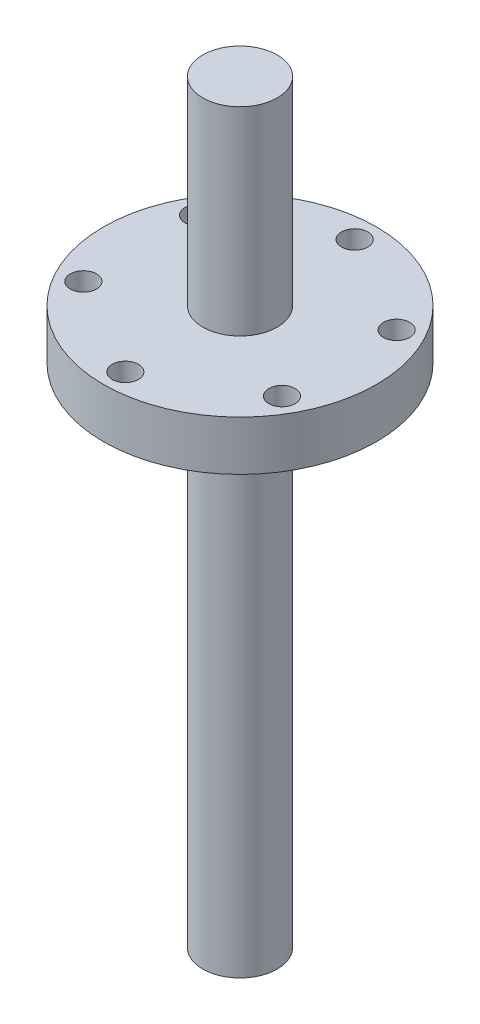
ISO-10303-21;
HEADER;
FILE_DESCRIPTION(('STEP AP214'),'2;1');
FILE_NAME('part.step','',(''),(''),'','','');
FILE_SCHEMA(('AUTOMOTIVE_DESIGN { 1 0 10303 214 1 1 1 1 }'));
ENDSEC;
DATA;
#1=APPLICATION_CONTEXT('core data for automotive mechanical design processes');
#2=APPLICATION_PROTOCOL_DEFINITION('international standard','automotive_design',2000,#1);
#3=PRODUCT_CONTEXT('',#1,'mechanical');
#4=PRODUCT('Part','Part','',(#3));
#5=PRODUCT_RELATED_PRODUCT_CATEGORY('part','',(#4));
#6=PRODUCT_DEFINITION_FORMATION('','',#4);
#7=PRODUCT_DEFINITION_CONTEXT('part definition',#1,'design');
#8=PRODUCT_DEFINITION('design','',#6,#7);
#9=PRODUCT_DEFINITION_SHAPE('','',#8);
#10=(LENGTH_UNIT() NAMED_UNIT(*) SI_UNIT(.MILLI.,.METRE.));
#11=(NAMED_UNIT(*) PLANE_ANGLE_UNIT() SI_UNIT($,.RADIAN.));
#12=(NAMED_UNIT(*) SI_UNIT($,.STERADIAN.) SOLID_ANGLE_UNIT());
#13=UNCERTAINTY_MEASURE_WITH_UNIT(LENGTH_MEASURE(1.E-05),#10,'distance_accuracy_value','');
#14=(GEOMETRIC_REPRESENTATION_CONTEXT(3) GLOBAL_UNCERTAINTY_ASSIGNED_CONTEXT((#13)) GLOBAL_UNIT_ASSIGNED_CONTEXT((#10,
#11,#12)) REPRESENTATION_CONTEXT('',''));
#15=CARTESIAN_POINT('',(0.,0.,0.));
#16=DIRECTION('',(0.,0.,1.));
#17=DIRECTION('',(1.,0.,0.));
#18=AXIS2_PLACEMENT_3D('',#15,#16,#17);
#19=CARTESIAN_POINT('',(0.,12.7,0.));
#20=DIRECTION('',(0.,1.,0.));
#21=DIRECTION('',(0.,0.,1.));
#22=AXIS2_PLACEMENT_3D('',#19,#20,#21);
#23=PLANE('',#22);
#24=CARTESIAN_POINT('',(25.4065872708239,12.7,-14.6685000000003));
#25=DIRECTION('',(0.,1.,0.));
#26=DIRECTION('',(-0.866025403784433,0.,0.50000000000001));
#27=AXIS2_PLACEMENT_3D('',#24,#25,#26);
#28=CIRCLE('',#27,3.3655);
#29=CARTESIAN_POINT('',(22.4919787743874,12.7,-12.9857500000003));
#30=VERTEX_POINT('',#29);
#31=EDGE_CURVE('E68',#30,#30,#28,.T.);
#32=ORIENTED_EDGE('',*,*,#31,.F.);
#33=EDGE_LOOP('',(#32));
#34=FACE_BOUND('',#33,.T.);
#35=CARTESIAN_POINT('',(2.04859176075282E-13,12.7,29.337));
#36=DIRECTION('',(0.,1.,0.));
#37=DIRECTION('',(0.,0.,-1.));
#38=AXIS2_PLACEMENT_3D('',#35,#36,#37);
#39=CIRCLE('',#38,3.3655);
#40=CARTESIAN_POINT('',(1.81358015183529E-13,12.7,25.9715));
#41=VERTEX_POINT('',#40);
#42=EDGE_CURVE('E56',#41,#41,#39,.T.);
#43=ORIENTED_EDGE('',*,*,#42,.F.);
#44=EDGE_LOOP('',(#43));
#45=FACE_BOUND('',#44,.T.);
#46=CARTESIAN_POINT('',(-25.4065872708241,12.7,-14.6684999999999));
#47=DIRECTION('',(0.,1.,0.));
#48=DIRECTION('',(0.86602540378444,0.,0.499999999999998));
#49=AXIS2_PLACEMENT_3D('',#46,#47,#48);
#50=CIRCLE('',#49,3.3655);
#51=CARTESIAN_POINT('',(-22.4919787743876,12.7,-12.9857499999999));
#52=VERTEX_POINT('',#51);
#53=EDGE_CURVE('E44',#52,#52,#50,.T.);
#54=ORIENTED_EDGE('',*,*,#53,.F.);
#55=EDGE_LOOP('',(#54));
#56=FACE_BOUND('',#55,.T.);
#57=CARTESIAN_POINT('',(0.,12.7,0.));
#58=DIRECTION('',(0.,1.,0.));
#59=DIRECTION('',(0.,0.,1.));
#60=AXIS2_PLACEMENT_3D('',#57,#58,#59);
#61=CIRCLE('',#60,34.925);
#62=CARTESIAN_POINT('',(0.,12.7,34.925));
#63=VERTEX_POINT('',#62);
#64=EDGE_CURVE('E10',#63,#63,#61,.T.);
#65=ORIENTED_EDGE('',*,*,#64,.T.);
#66=EDGE_LOOP('',(#65));
#67=FACE_BOUND('',#66,.T.);
#68=CARTESIAN_POINT('',(0.,12.7,-29.337));
#69=DIRECTION('',(0.,1.,0.));
#70=DIRECTION('',(0.,0.,1.));
#71=AXIS2_PLACEMENT_3D('',#68,#69,#70);
#72=CIRCLE('',#71,3.3655);
#73=CARTESIAN_POINT('',(0.,12.7,-25.9715));
#74=VERTEX_POINT('',#73);
#75=EDGE_CURVE('E39',#74,#74,#72,.T.);
#76=ORIENTED_EDGE('',*,*,#75,.F.);
#77=EDGE_LOOP('',(#76));
#78=FACE_BOUND('',#77,.T.);
#79=CARTESIAN_POINT('',(-25.406587270824,12.7,14.6685000000001));
#80=DIRECTION('',(0.,1.,0.));
#81=DIRECTION('',(0.866025403784436,0.,-0.500000000000004));
#82=AXIS2_PLACEMENT_3D('',#79,#80,#81);
#83=CIRCLE('',#82,3.3655);
#84=CARTESIAN_POINT('',(-22.4919787743875,12.7,12.9857500000001));
#85=VERTEX_POINT('',#84);
#86=EDGE_CURVE('E50',#85,#85,#83,.T.);
#87=ORIENTED_EDGE('',*,*,#86,.F.);
#88=EDGE_LOOP('',(#87));
#89=FACE_BOUND('',#88,.T.);
#90=CARTESIAN_POINT('',(25.4065872708242,12.7,14.6684999999998));
#91=DIRECTION('',(0.,1.,0.));
#92=DIRECTION('',(-0.866025403784443,0.,-0.499999999999992));
#93=AXIS2_PLACEMENT_3D('',#90,#91,#92);
#94=CIRCLE('',#93,3.3655);
#95=CARTESIAN_POINT('',(22.4919787743877,12.7,12.9857499999998));
#96=VERTEX_POINT('',#95);
#97=EDGE_CURVE('E62',#96,#96,#94,.T.);
#98=ORIENTED_EDGE('',*,*,#97,.F.);
#99=EDGE_LOOP('',(#98));
#100=FACE_BOUND('',#99,.T.);
#101=CARTESIAN_POINT('',(0.,12.7,0.));
#102=DIRECTION('',(0.,1.,0.));
#103=DIRECTION('',(0.,0.,1.));
#104=AXIS2_PLACEMENT_3D('',#101,#102,#103);
#105=CIRCLE('',#104,9.525);
#106=CARTESIAN_POINT('',(0.,12.7,9.525));
#107=VERTEX_POINT('',#106);
#108=EDGE_CURVE('E83',#107,#107,#105,.T.);
#109=ORIENTED_EDGE('',*,*,#108,.F.);
#110=EDGE_LOOP('',(#109));
#111=FACE_BOUND('',#110,.T.);
#112=ADVANCED_FACE('F28',(#34,#45,#56,#67,#78,#89,#100,#111),#23,.T.);
#113=CARTESIAN_POINT('',(0.,0.,0.));
#114=DIRECTION('',(0.,1.,0.));
#115=DIRECTION('',(0.,0.,1.));
#116=AXIS2_PLACEMENT_3D('',#113,#114,#115);
#117=PLANE('',#116);
#118=CARTESIAN_POINT('',(0.,0.,0.));
#119=DIRECTION('',(0.,1.,0.));
#120=DIRECTION('',(0.,0.,1.));
#121=AXIS2_PLACEMENT_3D('',#118,#119,#120);
#122=CIRCLE('',#121,9.525);
#123=CARTESIAN_POINT('',(0.,0.,9.525));
#124=VERTEX_POINT('',#123);
#125=EDGE_CURVE('E77',#124,#124,#122,.T.);
#126=ORIENTED_EDGE('',*,*,#125,.T.);
#127=EDGE_LOOP('',(#126));
#128=FACE_BOUND('',#127,.T.);
#129=CARTESIAN_POINT('',(25.4065872708242,0.,14.6684999999998));
#130=DIRECTION('',(0.,1.,0.));
#131=DIRECTION('',(-0.866025403784443,0.,-0.499999999999992));
#132=AXIS2_PLACEMENT_3D('',#129,#130,#131);
#133=CIRCLE('',#132,3.3655);
#134=CARTESIAN_POINT('',(22.4919787743877,0.,12.9857499999998));
#135=VERTEX_POINT('',#134);
#136=EDGE_CURVE('E65',#135,#135,#133,.T.);
#137=ORIENTED_EDGE('',*,*,#136,.T.);
#138=EDGE_LOOP('',(#137));
#139=FACE_BOUND('',#138,.T.);
#140=CARTESIAN_POINT('',(-25.406587270824,0.,14.6685000000001));
#141=DIRECTION('',(0.,1.,0.));
#142=DIRECTION('',(0.866025403784436,0.,-0.500000000000004));
#143=AXIS2_PLACEMENT_3D('',#140,#141,#142);
#144=CIRCLE('',#143,3.3655);
#145=CARTESIAN_POINT('',(-22.4919787743875,0.,12.9857500000001));
#146=VERTEX_POINT('',#145);
#147=EDGE_CURVE('E53',#146,#146,#144,.T.);
#148=ORIENTED_EDGE('',*,*,#147,.T.);
#149=EDGE_LOOP('',(#148));
#150=FACE_BOUND('',#149,.T.);
#151=CARTESIAN_POINT('',(0.,0.,-29.337));
#152=DIRECTION('',(0.,1.,0.));
#153=DIRECTION('',(0.,0.,1.));
#154=AXIS2_PLACEMENT_3D('',#151,#152,#153);
#155=CIRCLE('',#154,3.3655);
#156=CARTESIAN_POINT('',(0.,0.,-25.9715));
#157=VERTEX_POINT('',#156);
#158=EDGE_CURVE('E41',#157,#157,#155,.T.);
#159=ORIENTED_EDGE('',*,*,#158,.T.);
#160=EDGE_LOOP('',(#159));
#161=FACE_BOUND('',#160,.T.);
#162=CARTESIAN_POINT('',(0.,0.,0.));
#163=DIRECTION('',(0.,1.,0.));
#164=DIRECTION('',(0.,0.,1.));
#165=AXIS2_PLACEMENT_3D('',#162,#163,#164);
#166=CIRCLE('',#165,34.925);
#167=CARTESIAN_POINT('',(0.,0.,34.925));
#168=VERTEX_POINT('',#167);
#169=EDGE_CURVE('E32',#168,#168,#166,.T.);
#170=ORIENTED_EDGE('',*,*,#169,.F.);
#171=EDGE_LOOP('',(#170));
#172=FACE_BOUND('',#171,.T.);
#173=CARTESIAN_POINT('',(-25.4065872708241,0.,-14.6684999999999));
#174=DIRECTION('',(0.,1.,0.));
#175=DIRECTION('',(0.86602540378444,0.,0.499999999999998));
#176=AXIS2_PLACEMENT_3D('',#173,#174,#175);
#177=CIRCLE('',#176,3.3655);
#178=CARTESIAN_POINT('',(-22.4919787743876,0.,-12.9857499999999));
#179=VERTEX_POINT('',#178);
#180=EDGE_CURVE('E47',#179,#179,#177,.T.);
#181=ORIENTED_EDGE('',*,*,#180,.T.);
#182=EDGE_LOOP('',(#181));
#183=FACE_BOUND('',#182,.T.);
#184=CARTESIAN_POINT('',(2.04859176075282E-13,0.,29.337));
#185=DIRECTION('',(0.,1.,0.));
#186=DIRECTION('',(0.,0.,-1.));
#187=AXIS2_PLACEMENT_3D('',#184,#185,#186);
#188=CIRCLE('',#187,3.3655);
#189=CARTESIAN_POINT('',(1.81358015183529E-13,0.,25.9715));
#190=VERTEX_POINT('',#189);
#191=EDGE_CURVE('E59',#190,#190,#188,.T.);
#192=ORIENTED_EDGE('',*,*,#191,.T.);
#193=EDGE_LOOP('',(#192));
#194=FACE_BOUND('',#193,.T.);
#195=CARTESIAN_POINT('',(25.4065872708239,0.,-14.6685000000003));
#196=DIRECTION('',(0.,1.,0.));
#197=DIRECTION('',(-0.866025403784433,0.,0.50000000000001));
#198=AXIS2_PLACEMENT_3D('',#195,#196,#197);
#199=CIRCLE('',#198,3.3655);
#200=CARTESIAN_POINT('',(22.4919787743874,0.,-12.9857500000003));
#201=VERTEX_POINT('',#200);
#202=EDGE_CURVE('E71',#201,#201,#199,.T.);
#203=ORIENTED_EDGE('',*,*,#202,.T.);
#204=EDGE_LOOP('',(#203));
#205=FACE_BOUND('',#204,.T.);
#206=ADVANCED_FACE('F99',(#128,#139,#150,#161,#172,#183,#194,#205),#117,.F.);
#207=CARTESIAN_POINT('',(0.,12.7,0.));
#208=DIRECTION('',(0.,-1.,0.));
#209=DIRECTION('',(0.,0.,-1.));
#210=AXIS2_PLACEMENT_3D('',#207,#208,#209);
#211=CYLINDRICAL_SURFACE('',#210,34.925);
#212=ORIENTED_EDGE('',*,*,#64,.F.);
#213=EDGE_LOOP('',(#212));
#214=FACE_BOUND('',#213,.T.);
#215=ORIENTED_EDGE('',*,*,#169,.T.);
#216=EDGE_LOOP('',(#215));
#217=FACE_BOUND('',#216,.T.);
#218=ADVANCED_FACE('F30',(#214,#217),#211,.T.);
#219=CARTESIAN_POINT('',(0.,12.7,-29.337));
#220=DIRECTION('',(0.,-1.,0.));
#221=DIRECTION('',(0.,0.,-1.));
#222=AXIS2_PLACEMENT_3D('',#219,#220,#221);
#223=CYLINDRICAL_SURFACE('',#222,3.3655);
#224=ORIENTED_EDGE('',*,*,#75,.T.);
#225=EDGE_LOOP('',(#224));
#226=FACE_BOUND('',#225,.T.);
#227=ORIENTED_EDGE('',*,*,#158,.F.);
#228=EDGE_LOOP('',(#227));
#229=FACE_BOUND('',#228,.T.);
#230=ADVANCED_FACE('F109',(#226,#229),#223,.F.);
#231=CARTESIAN_POINT('',(-25.4065872708241,12.7,-14.6684999999999));
#232=DIRECTION('',(0.,-1.,0.));
#233=DIRECTION('',(0.,0.,-1.));
#234=AXIS2_PLACEMENT_3D('',#231,#232,#233);
#235=CYLINDRICAL_SURFACE('',#234,3.3655);
#236=ORIENTED_EDGE('',*,*,#53,.T.);
#237=EDGE_LOOP('',(#236));
#238=FACE_BOUND('',#237,.T.);
#239=ORIENTED_EDGE('',*,*,#180,.F.);
#240=EDGE_LOOP('',(#239));
#241=FACE_BOUND('',#240,.T.);
#242=ADVANCED_FACE('F112',(#238,#241),#235,.F.);
#243=CARTESIAN_POINT('',(-25.406587270824,12.7,14.6685000000001));
#244=DIRECTION('',(0.,-1.,0.));
#245=DIRECTION('',(0.,0.,-1.));
#246=AXIS2_PLACEMENT_3D('',#243,#244,#245);
#247=CYLINDRICAL_SURFACE('',#246,3.3655);
#248=ORIENTED_EDGE('',*,*,#86,.T.);
#249=EDGE_LOOP('',(#248));
#250=FACE_BOUND('',#249,.T.);
#251=ORIENTED_EDGE('',*,*,#147,.F.);
#252=EDGE_LOOP('',(#251));
#253=FACE_BOUND('',#252,.T.);
#254=ADVANCED_FACE('F116',(#250,#253),#247,.F.);
#255=CARTESIAN_POINT('',(2.04859176075282E-13,12.7,29.337));
#256=DIRECTION('',(0.,-1.,0.));
#257=DIRECTION('',(0.,0.,-1.));
#258=AXIS2_PLACEMENT_3D('',#255,#256,#257);
#259=CYLINDRICAL_SURFACE('',#258,3.3655);
#260=ORIENTED_EDGE('',*,*,#42,.T.);
#261=EDGE_LOOP('',(#260));
#262=FACE_BOUND('',#261,.T.);
#263=ORIENTED_EDGE('',*,*,#191,.F.);
#264=EDGE_LOOP('',(#263));
#265=FACE_BOUND('',#264,.T.);
#266=ADVANCED_FACE('F120',(#262,#265),#259,.F.);
#267=CARTESIAN_POINT('',(25.4065872708242,12.7,14.6684999999998));
#268=DIRECTION('',(0.,-1.,0.));
#269=DIRECTION('',(0.,0.,-1.));
#270=AXIS2_PLACEMENT_3D('',#267,#268,#269);
#271=CYLINDRICAL_SURFACE('',#270,3.3655);
#272=ORIENTED_EDGE('',*,*,#97,.T.);
#273=EDGE_LOOP('',(#272));
#274=FACE_BOUND('',#273,.T.);
#275=ORIENTED_EDGE('',*,*,#136,.F.);
#276=EDGE_LOOP('',(#275));
#277=FACE_BOUND('',#276,.T.);
#278=ADVANCED_FACE('F124',(#274,#277),#271,.F.);
#279=CARTESIAN_POINT('',(25.4065872708239,12.7,-14.6685000000003));
#280=DIRECTION('',(0.,-1.,0.));
#281=DIRECTION('',(0.,0.,-1.));
#282=AXIS2_PLACEMENT_3D('',#279,#280,#281);
#283=CYLINDRICAL_SURFACE('',#282,3.3655);
#284=ORIENTED_EDGE('',*,*,#31,.T.);
#285=EDGE_LOOP('',(#284));
#286=FACE_BOUND('',#285,.T.);
#287=ORIENTED_EDGE('',*,*,#202,.F.);
#288=EDGE_LOOP('',(#287));
#289=FACE_BOUND('',#288,.T.);
#290=ADVANCED_FACE('F128',(#286,#289),#283,.F.);
#291=CARTESIAN_POINT('',(0.,-129.54,0.));
#292=DIRECTION('',(0.,1.,0.));
#293=DIRECTION('',(0.,0.,1.));
#294=AXIS2_PLACEMENT_3D('',#291,#292,#293);
#295=CYLINDRICAL_SURFACE('',#294,9.525);
#296=CARTESIAN_POINT('',(0.,-129.54,0.));
#297=DIRECTION('',(0.,1.,0.));
#298=DIRECTION('',(0.,0.,1.));
#299=AXIS2_PLACEMENT_3D('',#296,#297,#298);
#300=CIRCLE('',#299,9.525);
#301=CARTESIAN_POINT('',(0.,-129.54,9.525));
#302=VERTEX_POINT('',#301);
#303=EDGE_CURVE('E74',#302,#302,#300,.T.);
#304=ORIENTED_EDGE('',*,*,#303,.T.);
#305=EDGE_LOOP('',(#304));
#306=FACE_BOUND('',#305,.T.);
#307=ORIENTED_EDGE('',*,*,#125,.F.);
#308=EDGE_LOOP('',(#307));
#309=FACE_BOUND('',#308,.T.);
#310=ADVANCED_FACE('F132',(#306,#309),#295,.T.);
#311=CARTESIAN_POINT('',(0.,-129.54,0.));
#312=DIRECTION('',(0.,1.,0.));
#313=DIRECTION('',(0.,0.,1.));
#314=AXIS2_PLACEMENT_3D('',#311,#312,#313);
#315=PLANE('',#314);
#316=ORIENTED_EDGE('',*,*,#303,.F.);
#317=EDGE_LOOP('',(#316));
#318=FACE_BOUND('',#317,.T.);
#319=ADVANCED_FACE('F94',(#318),#315,.F.);
#320=CARTESIAN_POINT('',(0.,63.5,0.));
#321=DIRECTION('',(0.,-1.,0.));
#322=DIRECTION('',(0.,0.,-1.));
#323=AXIS2_PLACEMENT_3D('',#320,#321,#322);
#324=CYLINDRICAL_SURFACE('',#323,9.525);
#325=CARTESIAN_POINT('',(0.,63.5,0.));
#326=DIRECTION('',(0.,1.,0.));
#327=DIRECTION('',(0.,0.,1.));
#328=AXIS2_PLACEMENT_3D('',#325,#326,#327);
#329=CIRCLE('',#328,9.525);
#330=CARTESIAN_POINT('',(0.,63.5,9.525));
#331=VERTEX_POINT('',#330);
#332=EDGE_CURVE('E80',#331,#331,#329,.T.);
#333=ORIENTED_EDGE('',*,*,#332,.F.);
#334=EDGE_LOOP('',(#333));
#335=FACE_BOUND('',#334,.T.);
#336=ORIENTED_EDGE('',*,*,#108,.T.);
#337=EDGE_LOOP('',(#336));
#338=FACE_BOUND('',#337,.T.);
#339=ADVANCED_FACE('F91',(#335,#338),#324,.T.);
#340=CARTESIAN_POINT('',(0.,63.5,0.));
#341=DIRECTION('',(0.,1.,0.));
#342=DIRECTION('',(0.,0.,1.));
#343=AXIS2_PLACEMENT_3D('',#340,#341,#342);
#344=PLANE('',#343);
#345=ORIENTED_EDGE('',*,*,#332,.T.);
#346=EDGE_LOOP('',(#345));
#347=FACE_BOUND('',#346,.T.);
#348=ADVANCED_FACE('F89',(#347),#344,.T.);
#349=CLOSED_SHELL('',(#112,#206,#218,#230,#242,#254,#266,#278,#290,#310,#319,#339,#348));
#350=MANIFOLD_SOLID_BREP('B2',#349);
#351=ADVANCED_BREP_SHAPE_REPRESENTATION('',(#18,#350),#14);
#352=SHAPE_DEFINITION_REPRESENTATION(#9,#351);
ENDSEC;
END-ISO-10303-21;
